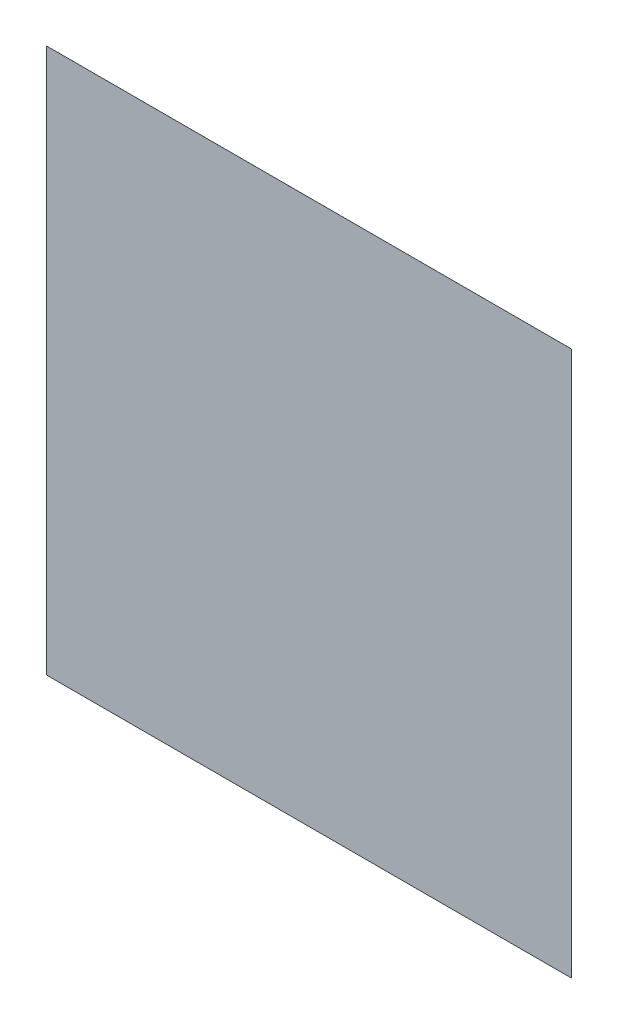
ISO-10303-21;
HEADER;
FILE_DESCRIPTION(('STEP AP214'),'2;1');
FILE_NAME('part.step','',(''),(''),'','','');
FILE_SCHEMA(('AUTOMOTIVE_DESIGN { 1 0 10303 214 1 1 1 1 }'));
ENDSEC;
DATA;
#1=APPLICATION_CONTEXT('core data for automotive mechanical design processes');
#2=APPLICATION_PROTOCOL_DEFINITION('international standard','automotive_design',2000,#1);
#3=PRODUCT_CONTEXT('',#1,'mechanical');
#4=PRODUCT('Part','Part','',(#3));
#5=PRODUCT_RELATED_PRODUCT_CATEGORY('part','',(#4));
#6=PRODUCT_DEFINITION_FORMATION('','',#4);
#7=PRODUCT_DEFINITION_CONTEXT('part definition',#1,'design');
#8=PRODUCT_DEFINITION('design','',#6,#7);
#9=PRODUCT_DEFINITION_SHAPE('','',#8);
#10=(LENGTH_UNIT() NAMED_UNIT(*) SI_UNIT(.MILLI.,.METRE.));
#11=(NAMED_UNIT(*) PLANE_ANGLE_UNIT() SI_UNIT($,.RADIAN.));
#12=(NAMED_UNIT(*) SI_UNIT($,.STERADIAN.) SOLID_ANGLE_UNIT());
#13=UNCERTAINTY_MEASURE_WITH_UNIT(LENGTH_MEASURE(1.E-05),#10,'distance_accuracy_value','');
#14=(GEOMETRIC_REPRESENTATION_CONTEXT(3) GLOBAL_UNCERTAINTY_ASSIGNED_CONTEXT((#13)) GLOBAL_UNIT_ASSIGNED_CONTEXT((#10,
#11,#12)) REPRESENTATION_CONTEXT('',''));
#15=CARTESIAN_POINT('',(0.,0.,0.));
#16=DIRECTION('',(0.,0.,1.));
#17=DIRECTION('',(1.,0.,0.));
#18=AXIS2_PLACEMENT_3D('',#15,#16,#17);
#19=CARTESIAN_POINT('',(-5.15078,5.53859,0.00025));
#20=DIRECTION('',(1.,0.,0.));
#21=DIRECTION('',(0.,0.,-1.));
#22=AXIS2_PLACEMENT_3D('',#19,#20,#21);
#23=PLANE('',#22);
#24=DIRECTION('',(0.,-1.,0.));
#25=VECTOR('',#24,1.);
#26=CARTESIAN_POINT('',(-5.15078,5.53859,0.));
#27=LINE('',#26,#25);
#28=CARTESIAN_POINT('',(-5.15078,5.53859,0.));
#29=VERTEX_POINT('',#28);
#30=CARTESIAN_POINT('',(-5.15078,-4.9168,0.));
#31=VERTEX_POINT('',#30);
#32=EDGE_CURVE('E104',#29,#31,#27,.T.);
#33=ORIENTED_EDGE('',*,*,#32,.T.);
#34=DIRECTION('',(0.,0.,-1.));
#35=VECTOR('',#34,1.);
#36=CARTESIAN_POINT('',(-5.15078,-4.9168,0.00025));
#37=LINE('',#36,#35);
#38=CARTESIAN_POINT('',(-5.15078,-4.9168,0.00025));
#39=VERTEX_POINT('',#38);
#40=EDGE_CURVE('E11',#39,#31,#37,.T.);
#41=ORIENTED_EDGE('',*,*,#40,.F.);
#42=DIRECTION('',(0.,-1.,0.));
#43=VECTOR('',#42,1.);
#44=CARTESIAN_POINT('',(-5.15078,5.53859,0.00025));
#45=LINE('',#44,#43);
#46=CARTESIAN_POINT('',(-5.15078,5.53859,0.00025));
#47=VERTEX_POINT('',#46);
#48=EDGE_CURVE('E92',#47,#39,#45,.T.);
#49=ORIENTED_EDGE('',*,*,#48,.F.);
#50=DIRECTION('',(0.,0.,-1.));
#51=VECTOR('',#50,1.);
#52=CARTESIAN_POINT('',(-5.15078,5.53859,0.00025));
#53=LINE('',#52,#51);
#54=EDGE_CURVE('E100',#47,#29,#53,.T.);
#55=ORIENTED_EDGE('',*,*,#54,.T.);
#56=EDGE_LOOP('',(#33,#41,#49,#55));
#57=FACE_BOUND('',#56,.T.);
#58=ADVANCED_FACE('F41',(#57),#23,.F.);
#59=CARTESIAN_POINT('',(-5.15078,-4.9168,0.00025));
#60=DIRECTION('',(0.,1.,0.));
#61=DIRECTION('',(0.,0.,1.));
#62=AXIS2_PLACEMENT_3D('',#59,#60,#61);
#63=PLANE('',#62);
#64=DIRECTION('',(1.,0.,0.));
#65=VECTOR('',#64,1.);
#66=CARTESIAN_POINT('',(-5.15078,-4.9168,0.));
#67=LINE('',#66,#65);
#68=CARTESIAN_POINT('',(4.91621,-4.9168,0.));
#69=VERTEX_POINT('',#68);
#70=EDGE_CURVE('E96',#31,#69,#67,.T.);
#71=ORIENTED_EDGE('',*,*,#70,.T.);
#72=DIRECTION('',(0.,0.,-1.));
#73=VECTOR('',#72,1.);
#74=CARTESIAN_POINT('',(4.91621,-4.9168,0.00025));
#75=LINE('',#74,#73);
#76=CARTESIAN_POINT('',(4.91621,-4.9168,0.00025));
#77=VERTEX_POINT('',#76);
#78=EDGE_CURVE('E49',#77,#69,#75,.T.);
#79=ORIENTED_EDGE('',*,*,#78,.F.);
#80=DIRECTION('',(1.,0.,0.));
#81=VECTOR('',#80,1.);
#82=CARTESIAN_POINT('',(-5.15078,-4.9168,0.00025));
#83=LINE('',#82,#81);
#84=EDGE_CURVE('E87',#39,#77,#83,.T.);
#85=ORIENTED_EDGE('',*,*,#84,.F.);
#86=ORIENTED_EDGE('',*,*,#40,.T.);
#87=EDGE_LOOP('',(#71,#79,#85,#86));
#88=FACE_BOUND('',#87,.T.);
#89=ADVANCED_FACE('F95',(#88),#63,.F.);
#90=CARTESIAN_POINT('',(4.91621,-4.9168,0.00025));
#91=DIRECTION('',(-1.,0.,0.));
#92=DIRECTION('',(0.,0.,1.));
#93=AXIS2_PLACEMENT_3D('',#90,#91,#92);
#94=PLANE('',#93);
#95=DIRECTION('',(0.,1.,0.));
#96=VECTOR('',#95,1.);
#97=CARTESIAN_POINT('',(4.91621,-4.9168,0.));
#98=LINE('',#97,#96);
#99=CARTESIAN_POINT('',(4.91621,5.53859,0.));
#100=VERTEX_POINT('',#99);
#101=EDGE_CURVE('E74',#69,#100,#98,.T.);
#102=ORIENTED_EDGE('',*,*,#101,.T.);
#103=DIRECTION('',(0.,0.,-1.));
#104=VECTOR('',#103,1.);
#105=CARTESIAN_POINT('',(4.91621,5.53859,0.00025));
#106=LINE('',#105,#104);
#107=CARTESIAN_POINT('',(4.91621,5.53859,0.00025));
#108=VERTEX_POINT('',#107);
#109=EDGE_CURVE('E97',#108,#100,#106,.T.);
#110=ORIENTED_EDGE('',*,*,#109,.F.);
#111=DIRECTION('',(0.,1.,0.));
#112=VECTOR('',#111,1.);
#113=CARTESIAN_POINT('',(4.91621,-4.9168,0.00025));
#114=LINE('',#113,#112);
#115=EDGE_CURVE('E90',#77,#108,#114,.T.);
#116=ORIENTED_EDGE('',*,*,#115,.F.);
#117=ORIENTED_EDGE('',*,*,#78,.T.);
#118=EDGE_LOOP('',(#102,#110,#116,#117));
#119=FACE_BOUND('',#118,.T.);
#120=ADVANCED_FACE('F98',(#119),#94,.F.);
#121=CARTESIAN_POINT('',(4.91621,5.53859,0.00025));
#122=DIRECTION('',(0.,-1.,0.));
#123=DIRECTION('',(0.,0.,-1.));
#124=AXIS2_PLACEMENT_3D('',#121,#122,#123);
#125=PLANE('',#124);
#126=DIRECTION('',(-1.,0.,0.));
#127=VECTOR('',#126,1.);
#128=CARTESIAN_POINT('',(4.91621,5.53859,0.));
#129=LINE('',#128,#127);
#130=EDGE_CURVE('E80',#100,#29,#129,.T.);
#131=ORIENTED_EDGE('',*,*,#130,.T.);
#132=ORIENTED_EDGE('',*,*,#54,.F.);
#133=DIRECTION('',(-1.,0.,0.));
#134=VECTOR('',#133,1.);
#135=CARTESIAN_POINT('',(4.91621,5.53859,0.00025));
#136=LINE('',#135,#134);
#137=EDGE_CURVE('E57',#108,#47,#136,.T.);
#138=ORIENTED_EDGE('',*,*,#137,.F.);
#139=ORIENTED_EDGE('',*,*,#109,.T.);
#140=EDGE_LOOP('',(#131,#132,#138,#139));
#141=FACE_BOUND('',#140,.T.);
#142=ADVANCED_FACE('F111',(#141),#125,.F.);
#143=CARTESIAN_POINT('',(0.,0.,0.00025));
#144=DIRECTION('',(0.,0.,1.));
#145=DIRECTION('',(1.,0.,0.));
#146=AXIS2_PLACEMENT_3D('',#143,#144,#145);
#147=PLANE('',#146);
#148=ORIENTED_EDGE('',*,*,#48,.T.);
#149=ORIENTED_EDGE('',*,*,#84,.T.);
#150=ORIENTED_EDGE('',*,*,#115,.T.);
#151=ORIENTED_EDGE('',*,*,#137,.T.);
#152=EDGE_LOOP('',(#148,#149,#150,#151));
#153=FACE_BOUND('',#152,.T.);
#154=ADVANCED_FACE('F88',(#153),#147,.T.);
#155=CARTESIAN_POINT('',(0.,0.,0.));
#156=DIRECTION('',(0.,0.,1.));
#157=DIRECTION('',(1.,0.,0.));
#158=AXIS2_PLACEMENT_3D('',#155,#156,#157);
#159=PLANE('',#158);
#160=ORIENTED_EDGE('',*,*,#32,.F.);
#161=ORIENTED_EDGE('',*,*,#130,.F.);
#162=ORIENTED_EDGE('',*,*,#101,.F.);
#163=ORIENTED_EDGE('',*,*,#70,.F.);
#164=EDGE_LOOP('',(#160,#161,#162,#163));
#165=FACE_BOUND('',#164,.T.);
#166=ADVANCED_FACE('F114',(#165),#159,.F.);
#167=CLOSED_SHELL('',(#58,#89,#120,#142,#154,#166));
#168=MANIFOLD_SOLID_BREP('B2',#167);
#169=ADVANCED_BREP_SHAPE_REPRESENTATION('',(#18,#168),#14);
#170=SHAPE_DEFINITION_REPRESENTATION(#9,#169);
ENDSEC;
END-ISO-10303-21;
